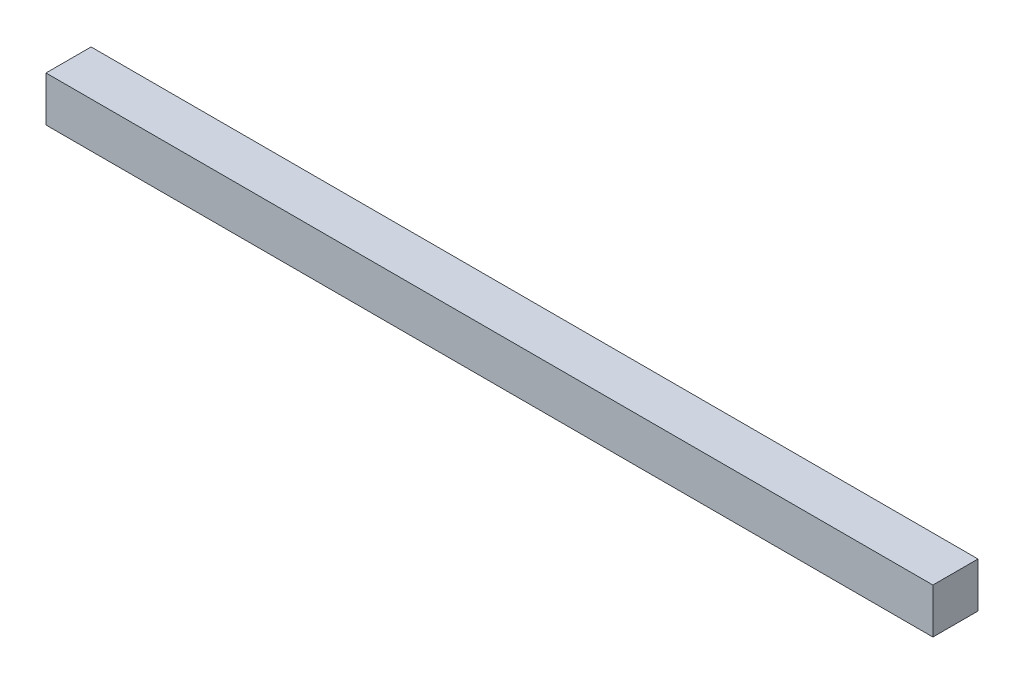
ISO-10303-21;
HEADER;
FILE_DESCRIPTION(('STEP AP214'),'2;1');
FILE_NAME('part.step','',(''),(''),'','','');
FILE_SCHEMA(('AUTOMOTIVE_DESIGN { 1 0 10303 214 1 1 1 1 }'));
ENDSEC;
DATA;
#1=APPLICATION_CONTEXT('core data for automotive mechanical design processes');
#2=APPLICATION_PROTOCOL_DEFINITION('international standard','automotive_design',2000,#1);
#3=PRODUCT_CONTEXT('',#1,'mechanical');
#4=PRODUCT('Part','Part','',(#3));
#5=PRODUCT_RELATED_PRODUCT_CATEGORY('part','',(#4));
#6=PRODUCT_DEFINITION_FORMATION('','',#4);
#7=PRODUCT_DEFINITION_CONTEXT('part definition',#1,'design');
#8=PRODUCT_DEFINITION('design','',#6,#7);
#9=PRODUCT_DEFINITION_SHAPE('','',#8);
#10=(LENGTH_UNIT() NAMED_UNIT(*) SI_UNIT(.MILLI.,.METRE.));
#11=(NAMED_UNIT(*) PLANE_ANGLE_UNIT() SI_UNIT($,.RADIAN.));
#12=(NAMED_UNIT(*) SI_UNIT($,.STERADIAN.) SOLID_ANGLE_UNIT());
#13=UNCERTAINTY_MEASURE_WITH_UNIT(LENGTH_MEASURE(1.E-05),#10,'distance_accuracy_value','');
#14=(GEOMETRIC_REPRESENTATION_CONTEXT(3) GLOBAL_UNCERTAINTY_ASSIGNED_CONTEXT((#13)) GLOBAL_UNIT_ASSIGNED_CONTEXT((#10,
#11,#12)) REPRESENTATION_CONTEXT('',''));
#15=CARTESIAN_POINT('',(0.,0.,0.));
#16=DIRECTION('',(0.,0.,1.));
#17=DIRECTION('',(1.,0.,0.));
#18=AXIS2_PLACEMENT_3D('',#15,#16,#17);
#19=CARTESIAN_POINT('',(0.,30.,0.));
#20=DIRECTION('',(1.,0.,0.));
#21=DIRECTION('',(0.,0.,-1.));
#22=AXIS2_PLACEMENT_3D('',#19,#20,#21);
#23=PLANE('',#22);
#24=DIRECTION('',(0.,0.,1.));
#25=VECTOR('',#24,1.);
#26=CARTESIAN_POINT('',(0.,0.,0.));
#27=LINE('',#26,#25);
#28=CARTESIAN_POINT('',(0.,0.,-30.));
#29=VERTEX_POINT('',#28);
#30=CARTESIAN_POINT('',(0.,0.,0.));
#31=VERTEX_POINT('',#30);
#32=EDGE_CURVE('E96',#29,#31,#27,.T.);
#33=ORIENTED_EDGE('',*,*,#32,.T.);
#34=DIRECTION('',(0.,-1.,0.));
#35=VECTOR('',#34,1.);
#36=CARTESIAN_POINT('',(0.,30.,0.));
#37=LINE('',#36,#35);
#38=CARTESIAN_POINT('',(0.,30.,0.));
#39=VERTEX_POINT('',#38);
#40=EDGE_CURVE('E11',#39,#31,#37,.T.);
#41=ORIENTED_EDGE('',*,*,#40,.F.);
#42=DIRECTION('',(0.,0.,1.));
#43=VECTOR('',#42,1.);
#44=CARTESIAN_POINT('',(0.,30.,0.));
#45=LINE('',#44,#43);
#46=CARTESIAN_POINT('',(0.,30.,-30.));
#47=VERTEX_POINT('',#46);
#48=EDGE_CURVE('E84',#47,#39,#45,.T.);
#49=ORIENTED_EDGE('',*,*,#48,.F.);
#50=DIRECTION('',(0.,-1.,0.));
#51=VECTOR('',#50,1.);
#52=CARTESIAN_POINT('',(0.,30.,-30.));
#53=LINE('',#52,#51);
#54=EDGE_CURVE('E92',#47,#29,#53,.T.);
#55=ORIENTED_EDGE('',*,*,#54,.T.);
#56=EDGE_LOOP('',(#33,#41,#49,#55));
#57=FACE_BOUND('',#56,.T.);
#58=ADVANCED_FACE('F33',(#57),#23,.F.);
#59=CARTESIAN_POINT('',(0.,30.,0.));
#60=DIRECTION('',(0.,0.,-1.));
#61=DIRECTION('',(-1.,0.,0.));
#62=AXIS2_PLACEMENT_3D('',#59,#60,#61);
#63=PLANE('',#62);
#64=DIRECTION('',(1.,0.,0.));
#65=VECTOR('',#64,1.);
#66=CARTESIAN_POINT('',(0.,0.,0.));
#67=LINE('',#66,#65);
#68=CARTESIAN_POINT('',(590.,0.,0.));
#69=VERTEX_POINT('',#68);
#70=EDGE_CURVE('E88',#31,#69,#67,.T.);
#71=ORIENTED_EDGE('',*,*,#70,.T.);
#72=DIRECTION('',(0.,-1.,0.));
#73=VECTOR('',#72,1.);
#74=CARTESIAN_POINT('',(590.,30.,0.));
#75=LINE('',#74,#73);
#76=CARTESIAN_POINT('',(590.,30.,0.));
#77=VERTEX_POINT('',#76);
#78=EDGE_CURVE('E41',#77,#69,#75,.T.);
#79=ORIENTED_EDGE('',*,*,#78,.F.);
#80=DIRECTION('',(1.,0.,0.));
#81=VECTOR('',#80,1.);
#82=CARTESIAN_POINT('',(0.,30.,0.));
#83=LINE('',#82,#81);
#84=EDGE_CURVE('E79',#39,#77,#83,.T.);
#85=ORIENTED_EDGE('',*,*,#84,.F.);
#86=ORIENTED_EDGE('',*,*,#40,.T.);
#87=EDGE_LOOP('',(#71,#79,#85,#86));
#88=FACE_BOUND('',#87,.T.);
#89=ADVANCED_FACE('F87',(#88),#63,.F.);
#90=CARTESIAN_POINT('',(590.,30.,0.));
#91=DIRECTION('',(-1.,0.,0.));
#92=DIRECTION('',(0.,0.,1.));
#93=AXIS2_PLACEMENT_3D('',#90,#91,#92);
#94=PLANE('',#93);
#95=DIRECTION('',(0.,0.,-1.));
#96=VECTOR('',#95,1.);
#97=CARTESIAN_POINT('',(590.,0.,0.));
#98=LINE('',#97,#96);
#99=CARTESIAN_POINT('',(590.,0.,-30.));
#100=VERTEX_POINT('',#99);
#101=EDGE_CURVE('E66',#69,#100,#98,.T.);
#102=ORIENTED_EDGE('',*,*,#101,.T.);
#103=DIRECTION('',(0.,-1.,0.));
#104=VECTOR('',#103,1.);
#105=CARTESIAN_POINT('',(590.,30.,-30.));
#106=LINE('',#105,#104);
#107=CARTESIAN_POINT('',(590.,30.,-30.));
#108=VERTEX_POINT('',#107);
#109=EDGE_CURVE('E89',#108,#100,#106,.T.);
#110=ORIENTED_EDGE('',*,*,#109,.F.);
#111=DIRECTION('',(0.,0.,-1.));
#112=VECTOR('',#111,1.);
#113=CARTESIAN_POINT('',(590.,30.,0.));
#114=LINE('',#113,#112);
#115=EDGE_CURVE('E82',#77,#108,#114,.T.);
#116=ORIENTED_EDGE('',*,*,#115,.F.);
#117=ORIENTED_EDGE('',*,*,#78,.T.);
#118=EDGE_LOOP('',(#102,#110,#116,#117));
#119=FACE_BOUND('',#118,.T.);
#120=ADVANCED_FACE('F90',(#119),#94,.F.);
#121=CARTESIAN_POINT('',(0.,30.,-30.));
#122=DIRECTION('',(0.,0.,1.));
#123=DIRECTION('',(1.,0.,0.));
#124=AXIS2_PLACEMENT_3D('',#121,#122,#123);
#125=PLANE('',#124);
#126=DIRECTION('',(-1.,0.,0.));
#127=VECTOR('',#126,1.);
#128=CARTESIAN_POINT('',(0.,0.,-30.));
#129=LINE('',#128,#127);
#130=EDGE_CURVE('E72',#100,#29,#129,.T.);
#131=ORIENTED_EDGE('',*,*,#130,.T.);
#132=ORIENTED_EDGE('',*,*,#54,.F.);
#133=DIRECTION('',(-1.,0.,0.));
#134=VECTOR('',#133,1.);
#135=CARTESIAN_POINT('',(0.,30.,-30.));
#136=LINE('',#135,#134);
#137=EDGE_CURVE('E49',#108,#47,#136,.T.);
#138=ORIENTED_EDGE('',*,*,#137,.F.);
#139=ORIENTED_EDGE('',*,*,#109,.T.);
#140=EDGE_LOOP('',(#131,#132,#138,#139));
#141=FACE_BOUND('',#140,.T.);
#142=ADVANCED_FACE('F103',(#141),#125,.F.);
#143=CARTESIAN_POINT('',(0.,30.,0.));
#144=DIRECTION('',(0.,-1.,0.));
#145=DIRECTION('',(0.,0.,-1.));
#146=AXIS2_PLACEMENT_3D('',#143,#144,#145);
#147=PLANE('',#146);
#148=ORIENTED_EDGE('',*,*,#48,.T.);
#149=ORIENTED_EDGE('',*,*,#84,.T.);
#150=ORIENTED_EDGE('',*,*,#115,.T.);
#151=ORIENTED_EDGE('',*,*,#137,.T.);
#152=EDGE_LOOP('',(#148,#149,#150,#151));
#153=FACE_BOUND('',#152,.T.);
#154=ADVANCED_FACE('F80',(#153),#147,.F.);
#155=CARTESIAN_POINT('',(0.,0.,0.));
#156=DIRECTION('',(0.,-1.,0.));
#157=DIRECTION('',(0.,0.,-1.));
#158=AXIS2_PLACEMENT_3D('',#155,#156,#157);
#159=PLANE('',#158);
#160=ORIENTED_EDGE('',*,*,#32,.F.);
#161=ORIENTED_EDGE('',*,*,#130,.F.);
#162=ORIENTED_EDGE('',*,*,#101,.F.);
#163=ORIENTED_EDGE('',*,*,#70,.F.);
#164=EDGE_LOOP('',(#160,#161,#162,#163));
#165=FACE_BOUND('',#164,.T.);
#166=ADVANCED_FACE('F106',(#165),#159,.T.);
#167=CLOSED_SHELL('',(#58,#89,#120,#142,#154,#166));
#168=MANIFOLD_SOLID_BREP('B2',#167);
#169=ADVANCED_BREP_SHAPE_REPRESENTATION('',(#18,#168),#14);
#170=SHAPE_DEFINITION_REPRESENTATION(#9,#169);
ENDSEC;
END-ISO-10303-21;
